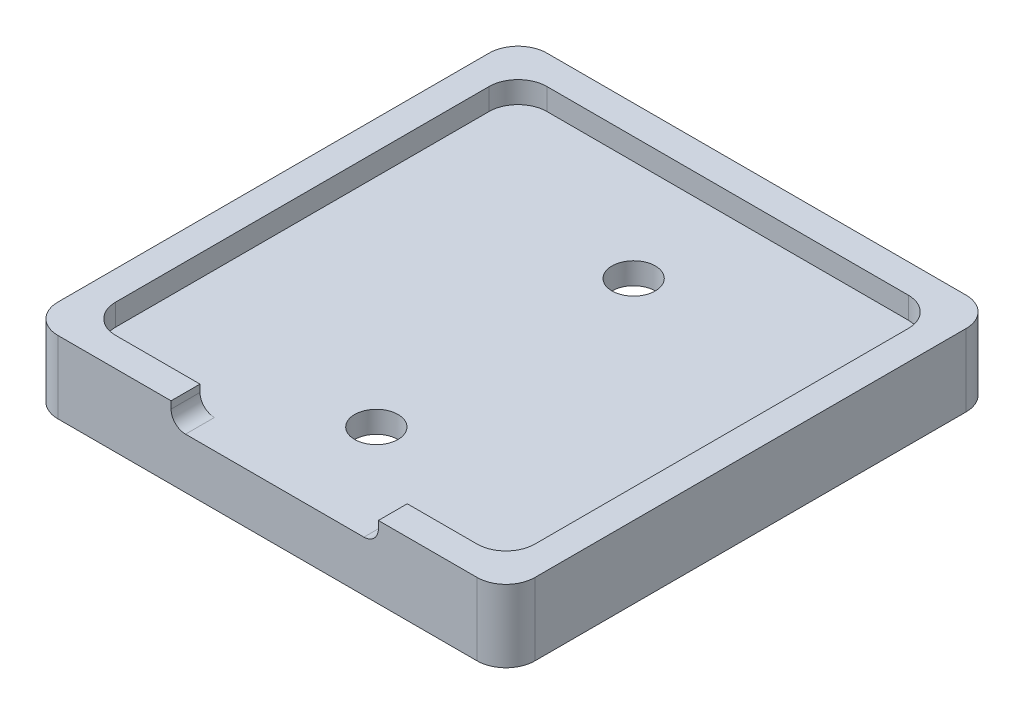
ISO-10303-21;
HEADER;
FILE_DESCRIPTION(('STEP AP214'),'2;1');
FILE_NAME('part.step','',(''),(''),'','','');
FILE_SCHEMA(('AUTOMOTIVE_DESIGN { 1 0 10303 214 1 1 1 1 }'));
ENDSEC;
DATA;
#1=APPLICATION_CONTEXT('core data for automotive mechanical design processes');
#2=APPLICATION_PROTOCOL_DEFINITION('international standard','automotive_design',2000,#1);
#3=PRODUCT_CONTEXT('',#1,'mechanical');
#4=PRODUCT('Part','Part','',(#3));
#5=PRODUCT_RELATED_PRODUCT_CATEGORY('part','',(#4));
#6=PRODUCT_DEFINITION_FORMATION('','',#4);
#7=PRODUCT_DEFINITION_CONTEXT('part definition',#1,'design');
#8=PRODUCT_DEFINITION('design','',#6,#7);
#9=PRODUCT_DEFINITION_SHAPE('','',#8);
#10=(LENGTH_UNIT() NAMED_UNIT(*) SI_UNIT(.MILLI.,.METRE.));
#11=(NAMED_UNIT(*) PLANE_ANGLE_UNIT() SI_UNIT($,.RADIAN.));
#12=(NAMED_UNIT(*) SI_UNIT($,.STERADIAN.) SOLID_ANGLE_UNIT());
#13=UNCERTAINTY_MEASURE_WITH_UNIT(LENGTH_MEASURE(1.E-05),#10,'distance_accuracy_value','');
#14=(GEOMETRIC_REPRESENTATION_CONTEXT(3) GLOBAL_UNCERTAINTY_ASSIGNED_CONTEXT((#13)) GLOBAL_UNIT_ASSIGNED_CONTEXT((#10,
#11,#12)) REPRESENTATION_CONTEXT('',''));
#15=CARTESIAN_POINT('',(0.,0.,0.));
#16=DIRECTION('',(0.,0.,1.));
#17=DIRECTION('',(1.,0.,0.));
#18=AXIS2_PLACEMENT_3D('',#15,#16,#17);
#19=CARTESIAN_POINT('',(-14.5,-1.5,14.915));
#20=DIRECTION('',(0.,0.,1.));
#21=DIRECTION('',(1.,0.,0.));
#22=AXIS2_PLACEMENT_3D('',#19,#20,#21);
#23=PLANE('',#22);
#24=DIRECTION('',(1.,0.,0.));
#25=VECTOR('',#24,1.);
#26=CARTESIAN_POINT('',(-14.5,-1.5,14.915));
#27=LINE('',#26,#25);
#28=CARTESIAN_POINT('',(6.67,-1.5,14.915));
#29=VERTEX_POINT('',#28);
#30=CARTESIAN_POINT('',(12.5,-1.5,14.915));
#31=VERTEX_POINT('',#30);
#32=EDGE_CURVE('E62',#29,#31,#27,.T.);
#33=ORIENTED_EDGE('',*,*,#32,.F.);
#34=CARTESIAN_POINT('',(6.67000000000001,-0.5,14.915));
#35=DIRECTION('',(0.,0.,1.));
#36=DIRECTION('',(1.,0.,0.));
#37=AXIS2_PLACEMENT_3D('',#34,#35,#36);
#38=CIRCLE('',#37,1.);
#39=CARTESIAN_POINT('',(7.67000000000001,-0.5,14.915));
#40=VERTEX_POINT('',#39);
#41=EDGE_CURVE('E11',#29,#40,#38,.T.);
#42=ORIENTED_EDGE('',*,*,#41,.T.);
#43=DIRECTION('',(0.,1.,0.));
#44=VECTOR('',#43,1.);
#45=CARTESIAN_POINT('',(7.67000000000001,-1.5,14.915));
#46=LINE('',#45,#44);
#47=CARTESIAN_POINT('',(7.67000000000001,0.,14.915));
#48=VERTEX_POINT('',#47);
#49=EDGE_CURVE('E512',#40,#48,#46,.T.);
#50=ORIENTED_EDGE('',*,*,#49,.T.);
#51=DIRECTION('',(1.,0.,0.));
#52=VECTOR('',#51,1.);
#53=CARTESIAN_POINT('',(-14.5,0.,14.915));
#54=LINE('',#53,#52);
#55=CARTESIAN_POINT('',(12.5,0.,14.915));
#56=VERTEX_POINT('',#55);
#57=EDGE_CURVE('E317',#48,#56,#54,.T.);
#58=ORIENTED_EDGE('',*,*,#57,.T.);
#59=DIRECTION('',(0.,1.,0.));
#60=VECTOR('',#59,1.);
#61=CARTESIAN_POINT('',(12.5,-1.5,14.915));
#62=LINE('',#61,#60);
#63=EDGE_CURVE('E354',#56,#31,#62,.F.);
#64=ORIENTED_EDGE('',*,*,#63,.T.);
#65=EDGE_LOOP('',(#33,#42,#50,#58,#64));
#66=FACE_BOUND('',#65,.T.);
#67=ADVANCED_FACE('F47',(#66),#23,.F.);
#68=CARTESIAN_POINT('',(5.50000000000001,-3.,9.885));
#69=DIRECTION('',(1.,0.,0.));
#70=DIRECTION('',(0.,0.,-1.));
#71=AXIS2_PLACEMENT_3D('',#68,#69,#70);
#72=PLANE('',#71);
#73=DIRECTION('',(0.,0.,1.));
#74=VECTOR('',#73,1.);
#75=CARTESIAN_POINT('',(5.50000000000001,-3.,9.885));
#76=LINE('',#75,#74);
#77=CARTESIAN_POINT('',(5.50000000000001,-3.,9.80203375084368));
#78=VERTEX_POINT('',#77);
#79=CARTESIAN_POINT('',(5.50000000000001,-3.,9.885));
#80=VERTEX_POINT('',#79);
#81=EDGE_CURVE('E588',#78,#80,#76,.T.);
#82=ORIENTED_EDGE('',*,*,#81,.F.);
#83=DIRECTION('',(0.,-1.,0.));
#84=VECTOR('',#83,1.);
#85=CARTESIAN_POINT('',(5.50000000000001,-3.,9.80203375084368));
#86=LINE('',#85,#84);
#87=CARTESIAN_POINT('',(5.50000000000001,-5.,9.80203375084368));
#88=VERTEX_POINT('',#87);
#89=EDGE_CURVE('E569',#78,#88,#86,.T.);
#90=ORIENTED_EDGE('',*,*,#89,.T.);
#91=DIRECTION('',(0.,0.,1.));
#92=VECTOR('',#91,1.);
#93=CARTESIAN_POINT('',(5.50000000000001,-5.,9.885));
#94=LINE('',#93,#92);
#95=CARTESIAN_POINT('',(5.50000000000001,-5.,9.885));
#96=VERTEX_POINT('',#95);
#97=EDGE_CURVE('E605',#88,#96,#94,.T.);
#98=ORIENTED_EDGE('',*,*,#97,.T.);
#99=DIRECTION('',(0.,-1.,0.));
#100=VECTOR('',#99,1.);
#101=CARTESIAN_POINT('',(5.50000000000001,-3.,9.885));
#102=LINE('',#101,#100);
#103=EDGE_CURVE('E322',#80,#96,#102,.T.);
#104=ORIENTED_EDGE('',*,*,#103,.F.);
#105=EDGE_LOOP('',(#82,#90,#98,#104));
#106=FACE_BOUND('',#105,.T.);
#107=ADVANCED_FACE('F708',(#106),#72,.F.);
#108=CARTESIAN_POINT('',(-4.49999999999999,-3.,9.885));
#109=DIRECTION('',(-1.,0.,0.));
#110=DIRECTION('',(0.,0.,1.));
#111=AXIS2_PLACEMENT_3D('',#108,#109,#110);
#112=PLANE('',#111);
#113=DIRECTION('',(0.,0.,-1.));
#114=VECTOR('',#113,1.);
#115=CARTESIAN_POINT('',(-4.49999999999999,-5.,9.885));
#116=LINE('',#115,#114);
#117=CARTESIAN_POINT('',(-4.49999999999999,-5.,9.885));
#118=VERTEX_POINT('',#117);
#119=CARTESIAN_POINT('',(-4.49999999999999,-5.,9.80203375084368));
#120=VERTEX_POINT('',#119);
#121=EDGE_CURVE('E597',#118,#120,#116,.T.);
#122=ORIENTED_EDGE('',*,*,#121,.T.);
#123=DIRECTION('',(0.,1.,0.));
#124=VECTOR('',#123,1.);
#125=CARTESIAN_POINT('',(-4.49999999999999,-3.,9.80203375084368));
#126=LINE('',#125,#124);
#127=CARTESIAN_POINT('',(-4.49999999999999,-3.,9.80203375084368));
#128=VERTEX_POINT('',#127);
#129=EDGE_CURVE('E432',#120,#128,#126,.T.);
#130=ORIENTED_EDGE('',*,*,#129,.T.);
#131=DIRECTION('',(0.,0.,-1.));
#132=VECTOR('',#131,1.);
#133=CARTESIAN_POINT('',(-4.49999999999999,-3.,9.885));
#134=LINE('',#133,#132);
#135=CARTESIAN_POINT('',(-4.49999999999999,-3.,9.885));
#136=VERTEX_POINT('',#135);
#137=EDGE_CURVE('E580',#136,#128,#134,.T.);
#138=ORIENTED_EDGE('',*,*,#137,.F.);
#139=DIRECTION('',(0.,-1.,0.));
#140=VECTOR('',#139,1.);
#141=CARTESIAN_POINT('',(-4.49999999999999,-3.,9.885));
#142=LINE('',#141,#140);
#143=EDGE_CURVE('E593',#136,#118,#142,.T.);
#144=ORIENTED_EDGE('',*,*,#143,.T.);
#145=EDGE_LOOP('',(#122,#130,#138,#144));
#146=FACE_BOUND('',#145,.T.);
#147=ADVANCED_FACE('F714',(#146),#112,.F.);
#148=CARTESIAN_POINT('',(0.500000000000011,-31.,9.885));
#149=DIRECTION('',(0.,1.,0.));
#150=DIRECTION('',(0.,0.,1.));
#151=AXIS2_PLACEMENT_3D('',#148,#149,#150);
#152=CYLINDRICAL_SURFACE('',#151,1.5);
#153=CARTESIAN_POINT('',(0.500000000000011,-1.5,9.885));
#154=DIRECTION('',(0.,1.,0.));
#155=DIRECTION('',(0.,0.,1.));
#156=AXIS2_PLACEMENT_3D('',#153,#154,#155);
#157=CIRCLE('',#156,1.5);
#158=CARTESIAN_POINT('',(0.500000000000011,-1.5,11.385));
#159=VERTEX_POINT('',#158);
#160=EDGE_CURVE('E308',#159,#159,#157,.T.);
#161=ORIENTED_EDGE('',*,*,#160,.T.);
#162=EDGE_LOOP('',(#161));
#163=FACE_BOUND('',#162,.T.);
#164=CARTESIAN_POINT('',(0.500000000000011,-3.,9.885));
#165=DIRECTION('',(0.,-1.,0.));
#166=DIRECTION('',(0.,0.,-1.));
#167=AXIS2_PLACEMENT_3D('',#164,#165,#166);
#168=CIRCLE('',#167,1.5);
#169=CARTESIAN_POINT('',(0.500000000000011,-3.,8.385));
#170=VERTEX_POINT('',#169);
#171=EDGE_CURVE('E313',#170,#170,#168,.F.);
#172=ORIENTED_EDGE('',*,*,#171,.F.);
#173=EDGE_LOOP('',(#172));
#174=FACE_BOUND('',#173,.T.);
#175=ADVANCED_FACE('F849',(#163,#174),#152,.F.);
#176=CARTESIAN_POINT('',(0.500000000000008,-31.,-7.915));
#177=DIRECTION('',(0.,1.,0.));
#178=DIRECTION('',(0.,0.,1.));
#179=AXIS2_PLACEMENT_3D('',#176,#177,#178);
#180=CYLINDRICAL_SURFACE('',#179,1.5);
#181=CARTESIAN_POINT('',(0.500000000000008,-1.5,-7.915));
#182=DIRECTION('',(0.,1.,0.));
#183=DIRECTION('',(0.,0.,1.));
#184=AXIS2_PLACEMENT_3D('',#181,#182,#183);
#185=CIRCLE('',#184,1.5);
#186=CARTESIAN_POINT('',(0.500000000000008,-1.5,-6.415));
#187=VERTEX_POINT('',#186);
#188=EDGE_CURVE('E312',#187,#187,#185,.T.);
#189=ORIENTED_EDGE('',*,*,#188,.T.);
#190=EDGE_LOOP('',(#189));
#191=FACE_BOUND('',#190,.T.);
#192=CARTESIAN_POINT('',(0.500000000000008,-3.,-7.915));
#193=DIRECTION('',(0.,-1.,0.));
#194=DIRECTION('',(0.,0.,-1.));
#195=AXIS2_PLACEMENT_3D('',#192,#193,#194);
#196=CIRCLE('',#195,1.5);
#197=CARTESIAN_POINT('',(0.500000000000008,-3.,-9.415));
#198=VERTEX_POINT('',#197);
#199=EDGE_CURVE('E318',#198,#198,#196,.F.);
#200=ORIENTED_EDGE('',*,*,#199,.F.);
#201=EDGE_LOOP('',(#200));
#202=FACE_BOUND('',#201,.T.);
#203=ADVANCED_FACE('F743',(#191,#202),#180,.F.);
#204=CARTESIAN_POINT('',(16.5,-5.,-16.915));
#205=DIRECTION('',(1.,0.,0.));
#206=DIRECTION('',(0.,0.,-1.));
#207=AXIS2_PLACEMENT_3D('',#204,#205,#206);
#208=PLANE('',#207);
#209=DIRECTION('',(0.,0.,-1.));
#210=VECTOR('',#209,1.);
#211=CARTESIAN_POINT('',(16.5,-5.,-16.915));
#212=LINE('',#211,#210);
#213=CARTESIAN_POINT('',(16.5,-5.,14.915));
#214=VERTEX_POINT('',#213);
#215=CARTESIAN_POINT('',(16.5,-5.,-14.915));
#216=VERTEX_POINT('',#215);
#217=EDGE_CURVE('E296',#214,#216,#212,.T.);
#218=ORIENTED_EDGE('',*,*,#217,.T.);
#219=DIRECTION('',(0.,1.,0.));
#220=VECTOR('',#219,1.);
#221=CARTESIAN_POINT('',(16.5,-5.,-14.915));
#222=LINE('',#221,#220);
#223=CARTESIAN_POINT('',(16.5,0.,-14.915));
#224=VERTEX_POINT('',#223);
#225=EDGE_CURVE('E411',#216,#224,#222,.T.);
#226=ORIENTED_EDGE('',*,*,#225,.T.);
#227=DIRECTION('',(0.,0.,-1.));
#228=VECTOR('',#227,1.);
#229=CARTESIAN_POINT('',(16.5,0.,-16.915));
#230=LINE('',#229,#228);
#231=CARTESIAN_POINT('',(16.5,0.,14.915));
#232=VERTEX_POINT('',#231);
#233=EDGE_CURVE('E471',#232,#224,#230,.T.);
#234=ORIENTED_EDGE('',*,*,#233,.F.);
#235=DIRECTION('',(0.,1.,0.));
#236=VECTOR('',#235,1.);
#237=CARTESIAN_POINT('',(16.5,-5.,14.915));
#238=LINE('',#237,#236);
#239=EDGE_CURVE('E408',#232,#214,#238,.F.);
#240=ORIENTED_EDGE('',*,*,#239,.T.);
#241=EDGE_LOOP('',(#218,#226,#234,#240));
#242=FACE_BOUND('',#241,.T.);
#243=ADVANCED_FACE('F736',(#242),#208,.T.);
#244=CARTESIAN_POINT('',(-16.5,-5.,16.915));
#245=DIRECTION('',(0.,0.,1.));
#246=DIRECTION('',(1.,0.,0.));
#247=AXIS2_PLACEMENT_3D('',#244,#245,#246);
#248=PLANE('',#247);
#249=DIRECTION('',(0.,1.,0.));
#250=VECTOR('',#249,1.);
#251=CARTESIAN_POINT('',(7.67000000000001,-1.5,16.915));
#252=LINE('',#251,#250);
#253=CARTESIAN_POINT('',(7.67000000000001,-0.5,16.915));
#254=VERTEX_POINT('',#253);
#255=CARTESIAN_POINT('',(7.67000000000001,0.,16.915));
#256=VERTEX_POINT('',#255);
#257=EDGE_CURVE('E281',#254,#256,#252,.T.);
#258=ORIENTED_EDGE('',*,*,#257,.F.);
#259=CARTESIAN_POINT('',(6.67000000000001,-0.5,16.915));
#260=DIRECTION('',(0.,0.,1.));
#261=DIRECTION('',(1.,0.,0.));
#262=AXIS2_PLACEMENT_3D('',#259,#260,#261);
#263=CIRCLE('',#262,1.);
#264=CARTESIAN_POINT('',(6.67000000000001,-1.5,16.915));
#265=VERTEX_POINT('',#264);
#266=EDGE_CURVE('E56',#254,#265,#263,.F.);
#267=ORIENTED_EDGE('',*,*,#266,.T.);
#268=DIRECTION('',(1.,0.,0.));
#269=VECTOR('',#268,1.);
#270=CARTESIAN_POINT('',(-6.66999999999999,-1.5,16.915));
#271=LINE('',#270,#269);
#272=CARTESIAN_POINT('',(-5.66999999999999,-1.5,16.915));
#273=VERTEX_POINT('',#272);
#274=EDGE_CURVE('E289',#273,#265,#271,.T.);
#275=ORIENTED_EDGE('',*,*,#274,.F.);
#276=CARTESIAN_POINT('',(-5.66999999999999,-0.5,16.915));
#277=DIRECTION('',(0.,0.,1.));
#278=DIRECTION('',(1.,0.,0.));
#279=AXIS2_PLACEMENT_3D('',#276,#277,#278);
#280=CIRCLE('',#279,1.);
#281=CARTESIAN_POINT('',(-6.66999999999999,-0.5,16.915));
#282=VERTEX_POINT('',#281);
#283=EDGE_CURVE('E287',#273,#282,#280,.F.);
#284=ORIENTED_EDGE('',*,*,#283,.T.);
#285=DIRECTION('',(0.,-1.,0.));
#286=VECTOR('',#285,1.);
#287=CARTESIAN_POINT('',(-6.66999999999999,0.,16.915));
#288=LINE('',#287,#286);
#289=CARTESIAN_POINT('',(-6.66999999999999,0.,16.915));
#290=VERTEX_POINT('',#289);
#291=EDGE_CURVE('E271',#290,#282,#288,.T.);
#292=ORIENTED_EDGE('',*,*,#291,.F.);
#293=DIRECTION('',(1.,0.,0.));
#294=VECTOR('',#293,1.);
#295=CARTESIAN_POINT('',(-16.5,0.,16.915));
#296=LINE('',#295,#294);
#297=CARTESIAN_POINT('',(-14.5,0.,16.915));
#298=VERTEX_POINT('',#297);
#299=EDGE_CURVE('E285',#298,#290,#296,.T.);
#300=ORIENTED_EDGE('',*,*,#299,.F.);
#301=DIRECTION('',(0.,1.,0.));
#302=VECTOR('',#301,1.);
#303=CARTESIAN_POINT('',(-14.5,-5.,16.915));
#304=LINE('',#303,#302);
#305=CARTESIAN_POINT('',(-14.5,-5.,16.915));
#306=VERTEX_POINT('',#305);
#307=EDGE_CURVE('E386',#298,#306,#304,.F.);
#308=ORIENTED_EDGE('',*,*,#307,.T.);
#309=DIRECTION('',(1.,0.,0.));
#310=VECTOR('',#309,1.);
#311=CARTESIAN_POINT('',(-16.5,-5.,16.915));
#312=LINE('',#311,#310);
#313=CARTESIAN_POINT('',(14.5,-5.,16.915));
#314=VERTEX_POINT('',#313);
#315=EDGE_CURVE('E327',#306,#314,#312,.T.);
#316=ORIENTED_EDGE('',*,*,#315,.T.);
#317=DIRECTION('',(0.,1.,0.));
#318=VECTOR('',#317,1.);
#319=CARTESIAN_POINT('',(14.5,-5.,16.915));
#320=LINE('',#319,#318);
#321=CARTESIAN_POINT('',(14.5,0.,16.915));
#322=VERTEX_POINT('',#321);
#323=EDGE_CURVE('E382',#314,#322,#320,.T.);
#324=ORIENTED_EDGE('',*,*,#323,.T.);
#325=EDGE_CURVE('E297',#256,#322,#296,.T.);
#326=ORIENTED_EDGE('',*,*,#325,.F.);
#327=EDGE_LOOP('',(#258,#267,#275,#284,#292,#300,#308,#316,#324,#326));
#328=FACE_BOUND('',#327,.T.);
#329=ADVANCED_FACE('F284',(#328),#248,.T.);
#330=CARTESIAN_POINT('',(-16.5,-5.,-16.915));
#331=DIRECTION('',(-1.,0.,0.));
#332=DIRECTION('',(0.,0.,1.));
#333=AXIS2_PLACEMENT_3D('',#330,#331,#332);
#334=PLANE('',#333);
#335=DIRECTION('',(0.,0.,1.));
#336=VECTOR('',#335,1.);
#337=CARTESIAN_POINT('',(-16.5,-5.,-16.915));
#338=LINE('',#337,#336);
#339=CARTESIAN_POINT('',(-16.5,-5.,-14.915));
#340=VERTEX_POINT('',#339);
#341=CARTESIAN_POINT('',(-16.5,-5.,14.915));
#342=VERTEX_POINT('',#341);
#343=EDGE_CURVE('E459',#340,#342,#338,.T.);
#344=ORIENTED_EDGE('',*,*,#343,.T.);
#345=DIRECTION('',(0.,1.,0.));
#346=VECTOR('',#345,1.);
#347=CARTESIAN_POINT('',(-16.5,-5.,14.915));
#348=LINE('',#347,#346);
#349=CARTESIAN_POINT('',(-16.5,0.,14.915));
#350=VERTEX_POINT('',#349);
#351=EDGE_CURVE('E367',#342,#350,#348,.T.);
#352=ORIENTED_EDGE('',*,*,#351,.T.);
#353=DIRECTION('',(0.,0.,1.));
#354=VECTOR('',#353,1.);
#355=CARTESIAN_POINT('',(-16.5,0.,-16.915));
#356=LINE('',#355,#354);
#357=CARTESIAN_POINT('',(-16.5,0.,-14.915));
#358=VERTEX_POINT('',#357);
#359=EDGE_CURVE('E304',#358,#350,#356,.T.);
#360=ORIENTED_EDGE('',*,*,#359,.F.);
#361=DIRECTION('',(0.,1.,0.));
#362=VECTOR('',#361,1.);
#363=CARTESIAN_POINT('',(-16.5,-5.,-14.915));
#364=LINE('',#363,#362);
#365=EDGE_CURVE('E364',#358,#340,#364,.F.);
#366=ORIENTED_EDGE('',*,*,#365,.T.);
#367=EDGE_LOOP('',(#344,#352,#360,#366));
#368=FACE_BOUND('',#367,.T.);
#369=ADVANCED_FACE('F483',(#368),#334,.T.);
#370=CARTESIAN_POINT('',(-16.5,-5.,-16.915));
#371=DIRECTION('',(0.,0.,-1.));
#372=DIRECTION('',(-1.,0.,0.));
#373=AXIS2_PLACEMENT_3D('',#370,#371,#372);
#374=PLANE('',#373);
#375=DIRECTION('',(-1.,0.,0.));
#376=VECTOR('',#375,1.);
#377=CARTESIAN_POINT('',(-16.5,-5.,-16.915));
#378=LINE('',#377,#376);
#379=CARTESIAN_POINT('',(14.5,-5.,-16.915));
#380=VERTEX_POINT('',#379);
#381=CARTESIAN_POINT('',(-14.5,-5.,-16.915));
#382=VERTEX_POINT('',#381);
#383=EDGE_CURVE('E302',#380,#382,#378,.T.);
#384=ORIENTED_EDGE('',*,*,#383,.T.);
#385=DIRECTION('',(0.,1.,0.));
#386=VECTOR('',#385,1.);
#387=CARTESIAN_POINT('',(-14.5,-5.,-16.915));
#388=LINE('',#387,#386);
#389=CARTESIAN_POINT('',(-14.5,0.,-16.915));
#390=VERTEX_POINT('',#389);
#391=EDGE_CURVE('E404',#382,#390,#388,.T.);
#392=ORIENTED_EDGE('',*,*,#391,.T.);
#393=DIRECTION('',(-1.,0.,0.));
#394=VECTOR('',#393,1.);
#395=CARTESIAN_POINT('',(-16.5,0.,-16.915));
#396=LINE('',#395,#394);
#397=CARTESIAN_POINT('',(14.5,0.,-16.915));
#398=VERTEX_POINT('',#397);
#399=EDGE_CURVE('E474',#398,#390,#396,.T.);
#400=ORIENTED_EDGE('',*,*,#399,.F.);
#401=DIRECTION('',(0.,1.,0.));
#402=VECTOR('',#401,1.);
#403=CARTESIAN_POINT('',(14.5,-5.,-16.915));
#404=LINE('',#403,#402);
#405=EDGE_CURVE('E401',#398,#380,#404,.F.);
#406=ORIENTED_EDGE('',*,*,#405,.T.);
#407=EDGE_LOOP('',(#384,#392,#400,#406));
#408=FACE_BOUND('',#407,.T.);
#409=ADVANCED_FACE('F732',(#408),#374,.T.);
#410=CARTESIAN_POINT('',(0.,-5.,0.));
#411=DIRECTION('',(0.,1.,0.));
#412=DIRECTION('',(0.,0.,1.));
#413=AXIS2_PLACEMENT_3D('',#410,#411,#412);
#414=PLANE('',#413);
#415=ORIENTED_EDGE('',*,*,#97,.F.);
#416=DIRECTION('',(-1.,0.,0.));
#417=VECTOR('',#416,1.);
#418=CARTESIAN_POINT('',(-5.34897163312394,-5.,9.80203375084368));
#419=LINE('',#418,#417);
#420=CARTESIAN_POINT('',(6.29587124224953,-5.,9.80203375084368));
#421=VERTEX_POINT('',#420);
#422=EDGE_CURVE('E525',#421,#88,#419,.T.);
#423=ORIENTED_EDGE('',*,*,#422,.F.);
#424=DIRECTION('',(0.,0.,1.));
#425=VECTOR('',#424,1.);
#426=CARTESIAN_POINT('',(6.29587124224953,-5.,9.80203375084368));
#427=LINE('',#426,#425);
#428=CARTESIAN_POINT('',(6.29587124224953,-5.,7.20513073792854));
#429=VERTEX_POINT('',#428);
#430=EDGE_CURVE('E545',#429,#421,#427,.T.);
#431=ORIENTED_EDGE('',*,*,#430,.F.);
#432=DIRECTION('',(1.,0.,0.));
#433=VECTOR('',#432,1.);
#434=CARTESIAN_POINT('',(-5.34897163312394,-5.,7.20513073792854));
#435=LINE('',#434,#433);
#436=CARTESIAN_POINT('',(5.50000000000001,-5.,7.20513073792854));
#437=VERTEX_POINT('',#436);
#438=EDGE_CURVE('E541',#437,#429,#435,.T.);
#439=ORIENTED_EDGE('',*,*,#438,.F.);
#440=CARTESIAN_POINT('',(5.50000000000001,-5.,-7.915));
#441=VERTEX_POINT('',#440);
#442=EDGE_CURVE('E579',#441,#437,#94,.T.);
#443=ORIENTED_EDGE('',*,*,#442,.F.);
#444=CARTESIAN_POINT('',(0.500000000000008,-5.,-7.915));
#445=DIRECTION('',(0.,-1.,0.));
#446=DIRECTION('',(0.,0.,-1.));
#447=AXIS2_PLACEMENT_3D('',#444,#445,#446);
#448=CIRCLE('',#447,5.);
#449=CARTESIAN_POINT('',(-4.49999999999999,-5.,-7.915));
#450=VERTEX_POINT('',#449);
#451=EDGE_CURVE('E601',#450,#441,#448,.T.);
#452=ORIENTED_EDGE('',*,*,#451,.F.);
#453=CARTESIAN_POINT('',(-4.49999999999999,-5.,7.20513073792854));
#454=VERTEX_POINT('',#453);
#455=EDGE_CURVE('E596',#454,#450,#116,.T.);
#456=ORIENTED_EDGE('',*,*,#455,.F.);
#457=CARTESIAN_POINT('',(-5.34897163312394,-5.,7.20513073792854));
#458=VERTEX_POINT('',#457);
#459=EDGE_CURVE('E542',#458,#454,#435,.T.);
#460=ORIENTED_EDGE('',*,*,#459,.F.);
#461=DIRECTION('',(0.,0.,-1.));
#462=VECTOR('',#461,1.);
#463=CARTESIAN_POINT('',(-5.34897163312394,-5.,9.80203375084368));
#464=LINE('',#463,#462);
#465=CARTESIAN_POINT('',(-5.34897163312394,-5.,9.80203375084368));
#466=VERTEX_POINT('',#465);
#467=EDGE_CURVE('E519',#466,#458,#464,.T.);
#468=ORIENTED_EDGE('',*,*,#467,.F.);
#469=EDGE_CURVE('E549',#120,#466,#419,.T.);
#470=ORIENTED_EDGE('',*,*,#469,.F.);
#471=ORIENTED_EDGE('',*,*,#121,.F.);
#472=CARTESIAN_POINT('',(0.500000000000011,-5.,9.885));
#473=DIRECTION('',(0.,-1.,0.));
#474=DIRECTION('',(0.,0.,-1.));
#475=AXIS2_PLACEMENT_3D('',#472,#473,#474);
#476=CIRCLE('',#475,5.);
#477=EDGE_CURVE('E573',#96,#118,#476,.T.);
#478=ORIENTED_EDGE('',*,*,#477,.F.);
#479=EDGE_LOOP('',(#415,#423,#431,#439,#443,#452,#456,#460,#468,#470,#471,#478));
#480=FACE_BOUND('',#479,.T.);
#481=ORIENTED_EDGE('',*,*,#315,.F.);
#482=CARTESIAN_POINT('',(-14.5,-5.,14.915));
#483=DIRECTION('',(0.,1.,0.));
#484=DIRECTION('',(0.,0.,1.));
#485=AXIS2_PLACEMENT_3D('',#482,#483,#484);
#486=CIRCLE('',#485,2.);
#487=EDGE_CURVE('E398',#306,#342,#486,.F.);
#488=ORIENTED_EDGE('',*,*,#487,.T.);
#489=ORIENTED_EDGE('',*,*,#343,.F.);
#490=CARTESIAN_POINT('',(-14.5,-5.,-14.915));
#491=DIRECTION('',(0.,1.,0.));
#492=DIRECTION('',(0.,0.,1.));
#493=AXIS2_PLACEMENT_3D('',#490,#491,#492);
#494=CIRCLE('',#493,2.);
#495=EDGE_CURVE('E395',#340,#382,#494,.F.);
#496=ORIENTED_EDGE('',*,*,#495,.T.);
#497=ORIENTED_EDGE('',*,*,#383,.F.);
#498=CARTESIAN_POINT('',(14.5,-5.,-14.915));
#499=DIRECTION('',(0.,1.,0.));
#500=DIRECTION('',(0.,0.,1.));
#501=AXIS2_PLACEMENT_3D('',#498,#499,#500);
#502=CIRCLE('',#501,2.);
#503=EDGE_CURVE('E392',#380,#216,#502,.F.);
#504=ORIENTED_EDGE('',*,*,#503,.T.);
#505=ORIENTED_EDGE('',*,*,#217,.F.);
#506=CARTESIAN_POINT('',(14.5,-5.,14.915));
#507=DIRECTION('',(0.,1.,0.));
#508=DIRECTION('',(0.,0.,1.));
#509=AXIS2_PLACEMENT_3D('',#506,#507,#508);
#510=CIRCLE('',#509,2.);
#511=EDGE_CURVE('E389',#214,#314,#510,.F.);
#512=ORIENTED_EDGE('',*,*,#511,.T.);
#513=EDGE_LOOP('',(#481,#488,#489,#496,#497,#504,#505,#512));
#514=FACE_BOUND('',#513,.T.);
#515=ADVANCED_FACE('F491',(#480,#514),#414,.F.);
#516=CARTESIAN_POINT('',(0.,0.,0.));
#517=DIRECTION('',(0.,1.,0.));
#518=DIRECTION('',(0.,0.,1.));
#519=AXIS2_PLACEMENT_3D('',#516,#517,#518);
#520=PLANE('',#519);
#521=DIRECTION('',(0.,0.,1.));
#522=VECTOR('',#521,1.);
#523=CARTESIAN_POINT('',(7.67000000000001,0.,6.915));
#524=LINE('',#523,#522);
#525=EDGE_CURVE('E280',#48,#256,#524,.T.);
#526=ORIENTED_EDGE('',*,*,#525,.T.);
#527=ORIENTED_EDGE('',*,*,#325,.T.);
#528=CARTESIAN_POINT('',(14.5,0.,14.915));
#529=DIRECTION('',(0.,1.,0.));
#530=DIRECTION('',(0.,0.,1.));
#531=AXIS2_PLACEMENT_3D('',#528,#529,#530);
#532=CIRCLE('',#531,2.);
#533=EDGE_CURVE('E371',#322,#232,#532,.T.);
#534=ORIENTED_EDGE('',*,*,#533,.T.);
#535=ORIENTED_EDGE('',*,*,#233,.T.);
#536=CARTESIAN_POINT('',(14.5,0.,-14.915));
#537=DIRECTION('',(0.,1.,0.));
#538=DIRECTION('',(0.,0.,1.));
#539=AXIS2_PLACEMENT_3D('',#536,#537,#538);
#540=CIRCLE('',#539,2.);
#541=EDGE_CURVE('E374',#224,#398,#540,.T.);
#542=ORIENTED_EDGE('',*,*,#541,.T.);
#543=ORIENTED_EDGE('',*,*,#399,.T.);
#544=CARTESIAN_POINT('',(-14.5,0.,-14.915));
#545=DIRECTION('',(0.,1.,0.));
#546=DIRECTION('',(0.,0.,1.));
#547=AXIS2_PLACEMENT_3D('',#544,#545,#546);
#548=CIRCLE('',#547,2.);
#549=EDGE_CURVE('E377',#390,#358,#548,.T.);
#550=ORIENTED_EDGE('',*,*,#549,.T.);
#551=ORIENTED_EDGE('',*,*,#359,.T.);
#552=CARTESIAN_POINT('',(-14.5,0.,14.915));
#553=DIRECTION('',(0.,1.,0.));
#554=DIRECTION('',(0.,0.,1.));
#555=AXIS2_PLACEMENT_3D('',#552,#553,#554);
#556=CIRCLE('',#555,2.);
#557=EDGE_CURVE('E294',#350,#298,#556,.T.);
#558=ORIENTED_EDGE('',*,*,#557,.T.);
#559=ORIENTED_EDGE('',*,*,#299,.T.);
#560=DIRECTION('',(0.,0.,1.));
#561=VECTOR('',#560,1.);
#562=CARTESIAN_POINT('',(-6.66999999999999,0.,6.915));
#563=LINE('',#562,#561);
#564=CARTESIAN_POINT('',(-6.66999999999999,0.,14.915));
#565=VERTEX_POINT('',#564);
#566=EDGE_CURVE('E268',#565,#290,#563,.T.);
#567=ORIENTED_EDGE('',*,*,#566,.F.);
#568=CARTESIAN_POINT('',(-12.5,0.,14.915));
#569=VERTEX_POINT('',#568);
#570=EDGE_CURVE('E639',#569,#565,#54,.T.);
#571=ORIENTED_EDGE('',*,*,#570,.F.);
#572=CARTESIAN_POINT('',(-12.5,0.,12.915));
#573=DIRECTION('',(0.,1.,0.));
#574=DIRECTION('',(0.,0.,1.));
#575=AXIS2_PLACEMENT_3D('',#572,#573,#574);
#576=CIRCLE('',#575,2.);
#577=CARTESIAN_POINT('',(-14.5,0.,12.915));
#578=VERTEX_POINT('',#577);
#579=EDGE_CURVE('E422',#569,#578,#576,.F.);
#580=ORIENTED_EDGE('',*,*,#579,.T.);
#581=DIRECTION('',(0.,0.,1.));
#582=VECTOR('',#581,1.);
#583=CARTESIAN_POINT('',(-14.5,0.,-14.915));
#584=LINE('',#583,#582);
#585=CARTESIAN_POINT('',(-14.5,0.,-12.915));
#586=VERTEX_POINT('',#585);
#587=EDGE_CURVE('E649',#586,#578,#584,.T.);
#588=ORIENTED_EDGE('',*,*,#587,.F.);
#589=CARTESIAN_POINT('',(-12.5,0.,-12.915));
#590=DIRECTION('',(0.,1.,0.));
#591=DIRECTION('',(0.,0.,1.));
#592=AXIS2_PLACEMENT_3D('',#589,#590,#591);
#593=CIRCLE('',#592,2.);
#594=CARTESIAN_POINT('',(-12.5,0.,-14.915));
#595=VERTEX_POINT('',#594);
#596=EDGE_CURVE('E425',#586,#595,#593,.F.);
#597=ORIENTED_EDGE('',*,*,#596,.T.);
#598=DIRECTION('',(-1.,0.,0.));
#599=VECTOR('',#598,1.);
#600=CARTESIAN_POINT('',(14.5,0.,-14.915));
#601=LINE('',#600,#599);
#602=CARTESIAN_POINT('',(12.5,0.,-14.915));
#603=VERTEX_POINT('',#602);
#604=EDGE_CURVE('E646',#603,#595,#601,.T.);
#605=ORIENTED_EDGE('',*,*,#604,.F.);
#606=CARTESIAN_POINT('',(12.5,0.,-12.915));
#607=DIRECTION('',(0.,1.,0.));
#608=DIRECTION('',(0.,0.,1.));
#609=AXIS2_PLACEMENT_3D('',#606,#607,#608);
#610=CIRCLE('',#609,2.);
#611=CARTESIAN_POINT('',(14.5,0.,-12.915));
#612=VERTEX_POINT('',#611);
#613=EDGE_CURVE('E415',#603,#612,#610,.F.);
#614=ORIENTED_EDGE('',*,*,#613,.T.);
#615=DIRECTION('',(0.,0.,-1.));
#616=VECTOR('',#615,1.);
#617=CARTESIAN_POINT('',(14.5,0.,14.915));
#618=LINE('',#617,#616);
#619=CARTESIAN_POINT('',(14.5,0.,12.915));
#620=VERTEX_POINT('',#619);
#621=EDGE_CURVE('E642',#620,#612,#618,.T.);
#622=ORIENTED_EDGE('',*,*,#621,.F.);
#623=CARTESIAN_POINT('',(12.5,0.,12.915));
#624=DIRECTION('',(0.,1.,0.));
#625=DIRECTION('',(0.,0.,1.));
#626=AXIS2_PLACEMENT_3D('',#623,#624,#625);
#627=CIRCLE('',#626,2.);
#628=EDGE_CURVE('E418',#620,#56,#627,.F.);
#629=ORIENTED_EDGE('',*,*,#628,.T.);
#630=ORIENTED_EDGE('',*,*,#57,.F.);
#631=EDGE_LOOP('',(#526,#527,#534,#535,#542,#543,#550,#551,#558,#559,#567,#571,#580,#588,#597,
#605,#614,#622,#629,#630));
#632=FACE_BOUND('',#631,.T.);
#633=ADVANCED_FACE('F292',(#632),#520,.T.);
#634=ORIENTED_EDGE('',*,*,#570,.T.);
#635=DIRECTION('',(0.,-1.,0.));
#636=VECTOR('',#635,1.);
#637=CARTESIAN_POINT('',(-6.66999999999999,-1.5,14.915));
#638=LINE('',#637,#636);
#639=CARTESIAN_POINT('',(-6.66999999999999,-0.5,14.915));
#640=VERTEX_POINT('',#639);
#641=EDGE_CURVE('E274',#565,#640,#638,.T.);
#642=ORIENTED_EDGE('',*,*,#641,.T.);
#643=CARTESIAN_POINT('',(-5.66999999999999,-0.5,14.915));
#644=DIRECTION('',(0.,0.,1.));
#645=DIRECTION('',(1.,0.,0.));
#646=AXIS2_PLACEMENT_3D('',#643,#644,#645);
#647=CIRCLE('',#646,1.);
#648=CARTESIAN_POINT('',(-5.66999999999999,-1.5,14.915));
#649=VERTEX_POINT('',#648);
#650=EDGE_CURVE('E445',#640,#649,#647,.T.);
#651=ORIENTED_EDGE('',*,*,#650,.T.);
#652=CARTESIAN_POINT('',(-12.5,-1.5,14.915));
#653=VERTEX_POINT('',#652);
#654=EDGE_CURVE('E625',#653,#649,#27,.T.);
#655=ORIENTED_EDGE('',*,*,#654,.F.);
#656=DIRECTION('',(0.,1.,0.));
#657=VECTOR('',#656,1.);
#658=CARTESIAN_POINT('',(-12.5,0.,14.915));
#659=LINE('',#658,#657);
#660=EDGE_CURVE('E350',#653,#569,#659,.T.);
#661=ORIENTED_EDGE('',*,*,#660,.T.);
#662=EDGE_LOOP('',(#634,#642,#651,#655,#661));
#663=FACE_BOUND('',#662,.T.);
#664=ADVANCED_FACE('F692',(#663),#23,.F.);
#665=CARTESIAN_POINT('',(-14.5,-1.5,-14.915));
#666=DIRECTION('',(-1.,0.,0.));
#667=DIRECTION('',(0.,0.,1.));
#668=AXIS2_PLACEMENT_3D('',#665,#666,#667);
#669=PLANE('',#668);
#670=ORIENTED_EDGE('',*,*,#587,.T.);
#671=DIRECTION('',(0.,1.,0.));
#672=VECTOR('',#671,1.);
#673=CARTESIAN_POINT('',(-14.5,-1.5,12.915));
#674=LINE('',#673,#672);
#675=CARTESIAN_POINT('',(-14.5,-1.5,12.915));
#676=VERTEX_POINT('',#675);
#677=EDGE_CURVE('E361',#578,#676,#674,.F.);
#678=ORIENTED_EDGE('',*,*,#677,.T.);
#679=DIRECTION('',(0.,0.,1.));
#680=VECTOR('',#679,1.);
#681=CARTESIAN_POINT('',(-14.5,-1.5,-14.915));
#682=LINE('',#681,#680);
#683=CARTESIAN_POINT('',(-14.5,-1.5,-12.915));
#684=VERTEX_POINT('',#683);
#685=EDGE_CURVE('E475',#684,#676,#682,.T.);
#686=ORIENTED_EDGE('',*,*,#685,.F.);
#687=DIRECTION('',(0.,1.,0.));
#688=VECTOR('',#687,1.);
#689=CARTESIAN_POINT('',(-14.5,0.,-12.915));
#690=LINE('',#689,#688);
#691=EDGE_CURVE('E357',#684,#586,#690,.T.);
#692=ORIENTED_EDGE('',*,*,#691,.T.);
#693=EDGE_LOOP('',(#670,#678,#686,#692));
#694=FACE_BOUND('',#693,.T.);
#695=ADVANCED_FACE('F685',(#694),#669,.F.);
#696=CARTESIAN_POINT('',(14.5,-1.5,-14.915));
#697=DIRECTION('',(0.,0.,-1.));
#698=DIRECTION('',(-1.,0.,0.));
#699=AXIS2_PLACEMENT_3D('',#696,#697,#698);
#700=PLANE('',#699);
#701=DIRECTION('',(-1.,0.,0.));
#702=VECTOR('',#701,1.);
#703=CARTESIAN_POINT('',(14.5,-1.5,-14.915));
#704=LINE('',#703,#702);
#705=CARTESIAN_POINT('',(12.5,-1.5,-14.915));
#706=VERTEX_POINT('',#705);
#707=CARTESIAN_POINT('',(-12.5,-1.5,-14.915));
#708=VERTEX_POINT('',#707);
#709=EDGE_CURVE('E632',#706,#708,#704,.T.);
#710=ORIENTED_EDGE('',*,*,#709,.F.);
#711=DIRECTION('',(0.,1.,0.));
#712=VECTOR('',#711,1.);
#713=CARTESIAN_POINT('',(12.5,0.,-14.915));
#714=LINE('',#713,#712);
#715=EDGE_CURVE('E326',#706,#603,#714,.T.);
#716=ORIENTED_EDGE('',*,*,#715,.T.);
#717=ORIENTED_EDGE('',*,*,#604,.T.);
#718=DIRECTION('',(0.,1.,0.));
#719=VECTOR('',#718,1.);
#720=CARTESIAN_POINT('',(-12.5,-1.5,-14.915));
#721=LINE('',#720,#719);
#722=EDGE_CURVE('E323',#595,#708,#721,.F.);
#723=ORIENTED_EDGE('',*,*,#722,.T.);
#724=EDGE_LOOP('',(#710,#716,#717,#723));
#725=FACE_BOUND('',#724,.T.);
#726=ADVANCED_FACE('F678',(#725),#700,.F.);
#727=CARTESIAN_POINT('',(14.5,-1.5,14.915));
#728=DIRECTION('',(1.,0.,0.));
#729=DIRECTION('',(0.,0.,-1.));
#730=AXIS2_PLACEMENT_3D('',#727,#728,#729);
#731=PLANE('',#730);
#732=ORIENTED_EDGE('',*,*,#621,.T.);
#733=DIRECTION('',(0.,1.,0.));
#734=VECTOR('',#733,1.);
#735=CARTESIAN_POINT('',(14.5,-1.5,-12.915));
#736=LINE('',#735,#734);
#737=CARTESIAN_POINT('',(14.5,-1.5,-12.915));
#738=VERTEX_POINT('',#737);
#739=EDGE_CURVE('E335',#612,#738,#736,.F.);
#740=ORIENTED_EDGE('',*,*,#739,.T.);
#741=DIRECTION('',(0.,0.,-1.));
#742=VECTOR('',#741,1.);
#743=CARTESIAN_POINT('',(14.5,-1.5,14.915));
#744=LINE('',#743,#742);
#745=CARTESIAN_POINT('',(14.5,-1.5,12.915));
#746=VERTEX_POINT('',#745);
#747=EDGE_CURVE('E628',#746,#738,#744,.T.);
#748=ORIENTED_EDGE('',*,*,#747,.F.);
#749=DIRECTION('',(0.,1.,0.));
#750=VECTOR('',#749,1.);
#751=CARTESIAN_POINT('',(14.5,0.,12.915));
#752=LINE('',#751,#750);
#753=EDGE_CURVE('E331',#746,#620,#752,.T.);
#754=ORIENTED_EDGE('',*,*,#753,.T.);
#755=EDGE_LOOP('',(#732,#740,#748,#754));
#756=FACE_BOUND('',#755,.T.);
#757=ADVANCED_FACE('F669',(#756),#731,.F.);
#758=CARTESIAN_POINT('',(0.,-1.5,0.));
#759=DIRECTION('',(0.,1.,0.));
#760=DIRECTION('',(0.,0.,1.));
#761=AXIS2_PLACEMENT_3D('',#758,#759,#760);
#762=PLANE('',#761);
#763=ORIENTED_EDGE('',*,*,#274,.T.);
#764=DIRECTION('',(0.,0.,1.));
#765=VECTOR('',#764,1.);
#766=CARTESIAN_POINT('',(6.67000000000001,-1.5,0.));
#767=LINE('',#766,#765);
#768=EDGE_CURVE('E453',#265,#29,#767,.F.);
#769=ORIENTED_EDGE('',*,*,#768,.T.);
#770=ORIENTED_EDGE('',*,*,#32,.T.);
#771=CARTESIAN_POINT('',(12.5,-1.5,12.915));
#772=DIRECTION('',(0.,1.,0.));
#773=DIRECTION('',(0.,0.,1.));
#774=AXIS2_PLACEMENT_3D('',#771,#772,#773);
#775=CIRCLE('',#774,2.);
#776=EDGE_CURVE('E344',#31,#746,#775,.T.);
#777=ORIENTED_EDGE('',*,*,#776,.T.);
#778=ORIENTED_EDGE('',*,*,#747,.T.);
#779=CARTESIAN_POINT('',(12.5,-1.5,-12.915));
#780=DIRECTION('',(0.,1.,0.));
#781=DIRECTION('',(0.,0.,1.));
#782=AXIS2_PLACEMENT_3D('',#779,#780,#781);
#783=CIRCLE('',#782,2.);
#784=EDGE_CURVE('E347',#738,#706,#783,.T.);
#785=ORIENTED_EDGE('',*,*,#784,.T.);
#786=ORIENTED_EDGE('',*,*,#709,.T.);
#787=CARTESIAN_POINT('',(-12.5,-1.5,-12.915));
#788=DIRECTION('',(0.,1.,0.));
#789=DIRECTION('',(0.,0.,1.));
#790=AXIS2_PLACEMENT_3D('',#787,#788,#789);
#791=CIRCLE('',#790,2.);
#792=EDGE_CURVE('E338',#708,#684,#791,.T.);
#793=ORIENTED_EDGE('',*,*,#792,.T.);
#794=ORIENTED_EDGE('',*,*,#685,.T.);
#795=CARTESIAN_POINT('',(-12.5,-1.5,12.915));
#796=DIRECTION('',(0.,1.,0.));
#797=DIRECTION('',(0.,0.,1.));
#798=AXIS2_PLACEMENT_3D('',#795,#796,#797);
#799=CIRCLE('',#798,2.);
#800=EDGE_CURVE('E341',#676,#653,#799,.T.);
#801=ORIENTED_EDGE('',*,*,#800,.T.);
#802=ORIENTED_EDGE('',*,*,#654,.T.);
#803=DIRECTION('',(0.,0.,1.));
#804=VECTOR('',#803,1.);
#805=CARTESIAN_POINT('',(-5.66999999999999,-1.5,0.));
#806=LINE('',#805,#804);
#807=EDGE_CURVE('E436',#649,#273,#806,.T.);
#808=ORIENTED_EDGE('',*,*,#807,.T.);
#809=EDGE_LOOP('',(#763,#769,#770,#777,#778,#785,#786,#793,#794,#801,#802,#808));
#810=FACE_BOUND('',#809,.T.);
#811=ORIENTED_EDGE('',*,*,#188,.F.);
#812=EDGE_LOOP('',(#811));
#813=FACE_BOUND('',#812,.T.);
#814=ORIENTED_EDGE('',*,*,#160,.F.);
#815=EDGE_LOOP('',(#814));
#816=FACE_BOUND('',#815,.T.);
#817=ADVANCED_FACE('F657',(#810,#813,#816),#762,.T.);
#818=CARTESIAN_POINT('',(0.500000000000011,-3.,9.885));
#819=DIRECTION('',(0.,-1.,0.));
#820=DIRECTION('',(0.,0.,-1.));
#821=AXIS2_PLACEMENT_3D('',#818,#819,#820);
#822=PLANE('',#821);
#823=ORIENTED_EDGE('',*,*,#171,.T.);
#824=EDGE_LOOP('',(#823));
#825=FACE_BOUND('',#824,.T.);
#826=CARTESIAN_POINT('',(5.50000000000001,-3.,-7.915));
#827=VERTEX_POINT('',#826);
#828=CARTESIAN_POINT('',(5.50000000000001,-3.,7.20513073792854));
#829=VERTEX_POINT('',#828);
#830=EDGE_CURVE('E589',#827,#829,#76,.T.);
#831=ORIENTED_EDGE('',*,*,#830,.T.);
#832=DIRECTION('',(1.,0.,0.));
#833=VECTOR('',#832,1.);
#834=CARTESIAN_POINT('',(-5.34897163312394,-3.,7.20513073792854));
#835=LINE('',#834,#833);
#836=CARTESIAN_POINT('',(6.29587124224953,-3.,7.20513073792854));
#837=VERTEX_POINT('',#836);
#838=EDGE_CURVE('E524',#829,#837,#835,.T.);
#839=ORIENTED_EDGE('',*,*,#838,.T.);
#840=DIRECTION('',(0.,0.,1.));
#841=VECTOR('',#840,1.);
#842=CARTESIAN_POINT('',(6.29587124224953,-3.,9.80203375084368));
#843=LINE('',#842,#841);
#844=CARTESIAN_POINT('',(6.29587124224953,-3.,9.80203375084368));
#845=VERTEX_POINT('',#844);
#846=EDGE_CURVE('E529',#837,#845,#843,.T.);
#847=ORIENTED_EDGE('',*,*,#846,.T.);
#848=DIRECTION('',(-1.,0.,0.));
#849=VECTOR('',#848,1.);
#850=CARTESIAN_POINT('',(-5.34897163312394,-3.,9.80203375084368));
#851=LINE('',#850,#849);
#852=EDGE_CURVE('E534',#845,#78,#851,.T.);
#853=ORIENTED_EDGE('',*,*,#852,.T.);
#854=ORIENTED_EDGE('',*,*,#81,.T.);
#855=CARTESIAN_POINT('',(0.500000000000011,-3.,9.885));
#856=DIRECTION('',(0.,-1.,0.));
#857=DIRECTION('',(0.,0.,-1.));
#858=AXIS2_PLACEMENT_3D('',#855,#856,#857);
#859=CIRCLE('',#858,5.);
#860=EDGE_CURVE('E574',#80,#136,#859,.T.);
#861=ORIENTED_EDGE('',*,*,#860,.T.);
#862=ORIENTED_EDGE('',*,*,#137,.T.);
#863=CARTESIAN_POINT('',(-5.34897163312394,-3.,9.80203375084368));
#864=VERTEX_POINT('',#863);
#865=EDGE_CURVE('E533',#128,#864,#851,.T.);
#866=ORIENTED_EDGE('',*,*,#865,.T.);
#867=DIRECTION('',(0.,0.,-1.));
#868=VECTOR('',#867,1.);
#869=CARTESIAN_POINT('',(-5.34897163312394,-3.,9.80203375084368));
#870=LINE('',#869,#868);
#871=CARTESIAN_POINT('',(-5.34897163312394,-3.,7.20513073792854));
#872=VERTEX_POINT('',#871);
#873=EDGE_CURVE('E520',#864,#872,#870,.T.);
#874=ORIENTED_EDGE('',*,*,#873,.T.);
#875=CARTESIAN_POINT('',(-4.49999999999999,-3.,7.20513073792854));
#876=VERTEX_POINT('',#875);
#877=EDGE_CURVE('E526',#872,#876,#835,.T.);
#878=ORIENTED_EDGE('',*,*,#877,.T.);
#879=CARTESIAN_POINT('',(-4.49999999999999,-3.,-7.915));
#880=VERTEX_POINT('',#879);
#881=EDGE_CURVE('E578',#876,#880,#134,.T.);
#882=ORIENTED_EDGE('',*,*,#881,.T.);
#883=CARTESIAN_POINT('',(0.500000000000008,-3.,-7.915));
#884=DIRECTION('',(0.,-1.,0.));
#885=DIRECTION('',(0.,0.,-1.));
#886=AXIS2_PLACEMENT_3D('',#883,#884,#885);
#887=CIRCLE('',#886,5.);
#888=EDGE_CURVE('E584',#880,#827,#887,.T.);
#889=ORIENTED_EDGE('',*,*,#888,.T.);
#890=EDGE_LOOP('',(#831,#839,#847,#853,#854,#861,#862,#866,#874,#878,#882,#889));
#891=FACE_BOUND('',#890,.T.);
#892=ORIENTED_EDGE('',*,*,#199,.T.);
#893=EDGE_LOOP('',(#892));
#894=FACE_BOUND('',#893,.T.);
#895=ADVANCED_FACE('F826',(#825,#891,#894),#822,.T.);
#896=CARTESIAN_POINT('',(0.500000000000011,-3.,9.885));
#897=DIRECTION('',(0.,-1.,0.));
#898=DIRECTION('',(0.,0.,-1.));
#899=AXIS2_PLACEMENT_3D('',#896,#897,#898);
#900=CYLINDRICAL_SURFACE('',#899,5.);
#901=ORIENTED_EDGE('',*,*,#477,.T.);
#902=ORIENTED_EDGE('',*,*,#143,.F.);
#903=ORIENTED_EDGE('',*,*,#860,.F.);
#904=ORIENTED_EDGE('',*,*,#103,.T.);
#905=EDGE_LOOP('',(#901,#902,#903,#904));
#906=FACE_BOUND('',#905,.T.);
#907=ADVANCED_FACE('F832',(#906),#900,.F.);
#908=ORIENTED_EDGE('',*,*,#442,.T.);
#909=DIRECTION('',(0.,1.,0.));
#910=VECTOR('',#909,1.);
#911=CARTESIAN_POINT('',(5.50000000000001,-3.,7.20513073792854));
#912=LINE('',#911,#910);
#913=EDGE_CURVE('E556',#437,#829,#912,.T.);
#914=ORIENTED_EDGE('',*,*,#913,.T.);
#915=ORIENTED_EDGE('',*,*,#830,.F.);
#916=DIRECTION('',(0.,-1.,0.));
#917=VECTOR('',#916,1.);
#918=CARTESIAN_POINT('',(5.50000000000001,-3.,-7.915));
#919=LINE('',#918,#917);
#920=EDGE_CURVE('E612',#827,#441,#919,.T.);
#921=ORIENTED_EDGE('',*,*,#920,.T.);
#922=EDGE_LOOP('',(#908,#914,#915,#921));
#923=FACE_BOUND('',#922,.T.);
#924=ADVANCED_FACE('F717',(#923),#72,.F.);
#925=CARTESIAN_POINT('',(0.500000000000008,-3.,-7.915));
#926=DIRECTION('',(0.,-1.,0.));
#927=DIRECTION('',(0.,0.,-1.));
#928=AXIS2_PLACEMENT_3D('',#925,#926,#927);
#929=CYLINDRICAL_SURFACE('',#928,5.);
#930=ORIENTED_EDGE('',*,*,#451,.T.);
#931=ORIENTED_EDGE('',*,*,#920,.F.);
#932=ORIENTED_EDGE('',*,*,#888,.F.);
#933=DIRECTION('',(0.,-1.,0.));
#934=VECTOR('',#933,1.);
#935=CARTESIAN_POINT('',(-4.49999999999999,-3.,-7.915));
#936=LINE('',#935,#934);
#937=EDGE_CURVE('E615',#880,#450,#936,.T.);
#938=ORIENTED_EDGE('',*,*,#937,.T.);
#939=EDGE_LOOP('',(#930,#931,#932,#938));
#940=FACE_BOUND('',#939,.T.);
#941=ADVANCED_FACE('F840',(#940),#929,.F.);
#942=ORIENTED_EDGE('',*,*,#881,.F.);
#943=DIRECTION('',(0.,-1.,0.));
#944=VECTOR('',#943,1.);
#945=CARTESIAN_POINT('',(-4.49999999999999,-3.,7.20513073792854));
#946=LINE('',#945,#944);
#947=EDGE_CURVE('E428',#876,#454,#946,.T.);
#948=ORIENTED_EDGE('',*,*,#947,.T.);
#949=ORIENTED_EDGE('',*,*,#455,.T.);
#950=ORIENTED_EDGE('',*,*,#937,.F.);
#951=EDGE_LOOP('',(#942,#948,#949,#950));
#952=FACE_BOUND('',#951,.T.);
#953=ADVANCED_FACE('F747',(#952),#112,.F.);
#954=CARTESIAN_POINT('',(12.5,-1.5,-12.915));
#955=DIRECTION('',(0.,-1.,0.));
#956=DIRECTION('',(0.,0.,-1.));
#957=AXIS2_PLACEMENT_3D('',#954,#955,#956);
#958=CYLINDRICAL_SURFACE('',#957,2.);
#959=ORIENTED_EDGE('',*,*,#784,.F.);
#960=ORIENTED_EDGE('',*,*,#739,.F.);
#961=ORIENTED_EDGE('',*,*,#613,.F.);
#962=ORIENTED_EDGE('',*,*,#715,.F.);
#963=EDGE_LOOP('',(#959,#960,#961,#962));
#964=FACE_BOUND('',#963,.T.);
#965=ADVANCED_FACE('F675',(#964),#958,.F.);
#966=CARTESIAN_POINT('',(12.5,-1.5,12.915));
#967=DIRECTION('',(0.,-1.,0.));
#968=DIRECTION('',(0.,0.,-1.));
#969=AXIS2_PLACEMENT_3D('',#966,#967,#968);
#970=CYLINDRICAL_SURFACE('',#969,2.);
#971=ORIENTED_EDGE('',*,*,#776,.F.);
#972=ORIENTED_EDGE('',*,*,#63,.F.);
#973=ORIENTED_EDGE('',*,*,#628,.F.);
#974=ORIENTED_EDGE('',*,*,#753,.F.);
#975=EDGE_LOOP('',(#971,#972,#973,#974));
#976=FACE_BOUND('',#975,.T.);
#977=ADVANCED_FACE('F666',(#976),#970,.F.);
#978=CARTESIAN_POINT('',(-12.5,-1.5,12.915));
#979=DIRECTION('',(0.,-1.,0.));
#980=DIRECTION('',(0.,0.,-1.));
#981=AXIS2_PLACEMENT_3D('',#978,#979,#980);
#982=CYLINDRICAL_SURFACE('',#981,2.);
#983=ORIENTED_EDGE('',*,*,#800,.F.);
#984=ORIENTED_EDGE('',*,*,#677,.F.);
#985=ORIENTED_EDGE('',*,*,#579,.F.);
#986=ORIENTED_EDGE('',*,*,#660,.F.);
#987=EDGE_LOOP('',(#983,#984,#985,#986));
#988=FACE_BOUND('',#987,.T.);
#989=ADVANCED_FACE('F689',(#988),#982,.F.);
#990=CARTESIAN_POINT('',(-14.5,-5.,14.915));
#991=DIRECTION('',(0.,1.,0.));
#992=DIRECTION('',(0.,0.,1.));
#993=AXIS2_PLACEMENT_3D('',#990,#991,#992);
#994=CYLINDRICAL_SURFACE('',#993,2.);
#995=ORIENTED_EDGE('',*,*,#487,.F.);
#996=ORIENTED_EDGE('',*,*,#307,.F.);
#997=ORIENTED_EDGE('',*,*,#557,.F.);
#998=ORIENTED_EDGE('',*,*,#351,.F.);
#999=EDGE_LOOP('',(#995,#996,#997,#998));
#1000=FACE_BOUND('',#999,.T.);
#1001=ADVANCED_FACE('F495',(#1000),#994,.T.);
#1002=CARTESIAN_POINT('',(-14.5,-5.,-14.915));
#1003=DIRECTION('',(0.,1.,0.));
#1004=DIRECTION('',(0.,0.,1.));
#1005=AXIS2_PLACEMENT_3D('',#1002,#1003,#1004);
#1006=CYLINDRICAL_SURFACE('',#1005,2.);
#1007=ORIENTED_EDGE('',*,*,#495,.F.);
#1008=ORIENTED_EDGE('',*,*,#365,.F.);
#1009=ORIENTED_EDGE('',*,*,#549,.F.);
#1010=ORIENTED_EDGE('',*,*,#391,.F.);
#1011=EDGE_LOOP('',(#1007,#1008,#1009,#1010));
#1012=FACE_BOUND('',#1011,.T.);
#1013=ADVANCED_FACE('F488',(#1012),#1006,.T.);
#1014=CARTESIAN_POINT('',(-12.5,-1.5,-12.915));
#1015=DIRECTION('',(0.,-1.,0.));
#1016=DIRECTION('',(0.,0.,-1.));
#1017=AXIS2_PLACEMENT_3D('',#1014,#1015,#1016);
#1018=CYLINDRICAL_SURFACE('',#1017,2.);
#1019=ORIENTED_EDGE('',*,*,#792,.F.);
#1020=ORIENTED_EDGE('',*,*,#722,.F.);
#1021=ORIENTED_EDGE('',*,*,#596,.F.);
#1022=ORIENTED_EDGE('',*,*,#691,.F.);
#1023=EDGE_LOOP('',(#1019,#1020,#1021,#1022));
#1024=FACE_BOUND('',#1023,.T.);
#1025=ADVANCED_FACE('F684',(#1024),#1018,.F.);
#1026=CARTESIAN_POINT('',(14.5,-5.,-14.915));
#1027=DIRECTION('',(0.,1.,0.));
#1028=DIRECTION('',(0.,0.,1.));
#1029=AXIS2_PLACEMENT_3D('',#1026,#1027,#1028);
#1030=CYLINDRICAL_SURFACE('',#1029,2.);
#1031=ORIENTED_EDGE('',*,*,#503,.F.);
#1032=ORIENTED_EDGE('',*,*,#405,.F.);
#1033=ORIENTED_EDGE('',*,*,#541,.F.);
#1034=ORIENTED_EDGE('',*,*,#225,.F.);
#1035=EDGE_LOOP('',(#1031,#1032,#1033,#1034));
#1036=FACE_BOUND('',#1035,.T.);
#1037=ADVANCED_FACE('F758',(#1036),#1030,.T.);
#1038=CARTESIAN_POINT('',(14.5,-5.,14.915));
#1039=DIRECTION('',(0.,1.,0.));
#1040=DIRECTION('',(0.,0.,1.));
#1041=AXIS2_PLACEMENT_3D('',#1038,#1039,#1040);
#1042=CYLINDRICAL_SURFACE('',#1041,2.);
#1043=ORIENTED_EDGE('',*,*,#511,.F.);
#1044=ORIENTED_EDGE('',*,*,#239,.F.);
#1045=ORIENTED_EDGE('',*,*,#533,.F.);
#1046=ORIENTED_EDGE('',*,*,#323,.F.);
#1047=EDGE_LOOP('',(#1043,#1044,#1045,#1046));
#1048=FACE_BOUND('',#1047,.T.);
#1049=ADVANCED_FACE('F501',(#1048),#1042,.T.);
#1050=CARTESIAN_POINT('',(-5.34897163312394,-3.,7.20513073792854));
#1051=DIRECTION('',(0.,0.,-1.));
#1052=DIRECTION('',(-1.,0.,0.));
#1053=AXIS2_PLACEMENT_3D('',#1050,#1051,#1052);
#1054=PLANE('',#1053);
#1055=ORIENTED_EDGE('',*,*,#877,.F.);
#1056=DIRECTION('',(0.,-1.,0.));
#1057=VECTOR('',#1056,1.);
#1058=CARTESIAN_POINT('',(-5.34897163312394,-3.,7.20513073792854));
#1059=LINE('',#1058,#1057);
#1060=EDGE_CURVE('E537',#872,#458,#1059,.T.);
#1061=ORIENTED_EDGE('',*,*,#1060,.T.);
#1062=ORIENTED_EDGE('',*,*,#459,.T.);
#1063=ORIENTED_EDGE('',*,*,#947,.F.);
#1064=EDGE_LOOP('',(#1055,#1061,#1062,#1063));
#1065=FACE_BOUND('',#1064,.T.);
#1066=ADVANCED_FACE('F763',(#1065),#1054,.F.);
#1067=CARTESIAN_POINT('',(-5.34897163312394,-3.,9.80203375084368));
#1068=DIRECTION('',(0.,0.,1.));
#1069=DIRECTION('',(1.,0.,0.));
#1070=AXIS2_PLACEMENT_3D('',#1067,#1068,#1069);
#1071=PLANE('',#1070);
#1072=ORIENTED_EDGE('',*,*,#469,.T.);
#1073=DIRECTION('',(0.,-1.,0.));
#1074=VECTOR('',#1073,1.);
#1075=CARTESIAN_POINT('',(-5.34897163312394,-3.,9.80203375084368));
#1076=LINE('',#1075,#1074);
#1077=EDGE_CURVE('E552',#864,#466,#1076,.T.);
#1078=ORIENTED_EDGE('',*,*,#1077,.F.);
#1079=ORIENTED_EDGE('',*,*,#865,.F.);
#1080=ORIENTED_EDGE('',*,*,#129,.F.);
#1081=EDGE_LOOP('',(#1072,#1078,#1079,#1080));
#1082=FACE_BOUND('',#1081,.T.);
#1083=ADVANCED_FACE('F767',(#1082),#1071,.F.);
#1084=CARTESIAN_POINT('',(-5.34897163312394,-3.,9.80203375084368));
#1085=DIRECTION('',(-1.,0.,0.));
#1086=DIRECTION('',(0.,0.,1.));
#1087=AXIS2_PLACEMENT_3D('',#1084,#1085,#1086);
#1088=PLANE('',#1087);
#1089=ORIENTED_EDGE('',*,*,#467,.T.);
#1090=ORIENTED_EDGE('',*,*,#1060,.F.);
#1091=ORIENTED_EDGE('',*,*,#873,.F.);
#1092=ORIENTED_EDGE('',*,*,#1077,.T.);
#1093=EDGE_LOOP('',(#1089,#1090,#1091,#1092));
#1094=FACE_BOUND('',#1093,.T.);
#1095=ADVANCED_FACE('F775',(#1094),#1088,.F.);
#1096=ORIENTED_EDGE('',*,*,#852,.F.);
#1097=DIRECTION('',(0.,-1.,0.));
#1098=VECTOR('',#1097,1.);
#1099=CARTESIAN_POINT('',(6.29587124224953,-3.,9.80203375084368));
#1100=LINE('',#1099,#1098);
#1101=EDGE_CURVE('E557',#845,#421,#1100,.T.);
#1102=ORIENTED_EDGE('',*,*,#1101,.T.);
#1103=ORIENTED_EDGE('',*,*,#422,.T.);
#1104=ORIENTED_EDGE('',*,*,#89,.F.);
#1105=EDGE_LOOP('',(#1096,#1102,#1103,#1104));
#1106=FACE_BOUND('',#1105,.T.);
#1107=ADVANCED_FACE('F778',(#1106),#1071,.F.);
#1108=ORIENTED_EDGE('',*,*,#438,.T.);
#1109=DIRECTION('',(0.,-1.,0.));
#1110=VECTOR('',#1109,1.);
#1111=CARTESIAN_POINT('',(6.29587124224953,-3.,7.20513073792854));
#1112=LINE('',#1111,#1110);
#1113=EDGE_CURVE('E560',#837,#429,#1112,.T.);
#1114=ORIENTED_EDGE('',*,*,#1113,.F.);
#1115=ORIENTED_EDGE('',*,*,#838,.F.);
#1116=ORIENTED_EDGE('',*,*,#913,.F.);
#1117=EDGE_LOOP('',(#1108,#1114,#1115,#1116));
#1118=FACE_BOUND('',#1117,.T.);
#1119=ADVANCED_FACE('F770',(#1118),#1054,.F.);
#1120=CARTESIAN_POINT('',(6.29587124224953,-3.,9.80203375084368));
#1121=DIRECTION('',(1.,0.,0.));
#1122=DIRECTION('',(0.,0.,-1.));
#1123=AXIS2_PLACEMENT_3D('',#1120,#1121,#1122);
#1124=PLANE('',#1123);
#1125=ORIENTED_EDGE('',*,*,#430,.T.);
#1126=ORIENTED_EDGE('',*,*,#1101,.F.);
#1127=ORIENTED_EDGE('',*,*,#846,.F.);
#1128=ORIENTED_EDGE('',*,*,#1113,.T.);
#1129=EDGE_LOOP('',(#1125,#1126,#1127,#1128));
#1130=FACE_BOUND('',#1129,.T.);
#1131=ADVANCED_FACE('F783',(#1130),#1124,.F.);
#1132=CARTESIAN_POINT('',(7.67000000000001,-1.5,6.915));
#1133=DIRECTION('',(1.,0.,0.));
#1134=DIRECTION('',(0.,0.,-1.));
#1135=AXIS2_PLACEMENT_3D('',#1132,#1133,#1134);
#1136=PLANE('',#1135);
#1137=ORIENTED_EDGE('',*,*,#49,.F.);
#1138=DIRECTION('',(0.,0.,1.));
#1139=VECTOR('',#1138,1.);
#1140=CARTESIAN_POINT('',(7.67000000000001,-0.5,6.915));
#1141=LINE('',#1140,#1139);
#1142=EDGE_CURVE('E449',#40,#254,#1141,.T.);
#1143=ORIENTED_EDGE('',*,*,#1142,.T.);
#1144=ORIENTED_EDGE('',*,*,#257,.T.);
#1145=ORIENTED_EDGE('',*,*,#525,.F.);
#1146=EDGE_LOOP('',(#1137,#1143,#1144,#1145));
#1147=FACE_BOUND('',#1146,.T.);
#1148=ADVANCED_FACE('F698',(#1147),#1136,.F.);
#1149=CARTESIAN_POINT('',(-6.66999999999999,0.,6.915));
#1150=DIRECTION('',(-1.,0.,0.));
#1151=DIRECTION('',(0.,0.,1.));
#1152=AXIS2_PLACEMENT_3D('',#1149,#1150,#1151);
#1153=PLANE('',#1152);
#1154=ORIENTED_EDGE('',*,*,#291,.T.);
#1155=DIRECTION('',(0.,0.,1.));
#1156=VECTOR('',#1155,1.);
#1157=CARTESIAN_POINT('',(-6.66999999999999,-0.5,6.915));
#1158=LINE('',#1157,#1156);
#1159=EDGE_CURVE('E440',#282,#640,#1158,.F.);
#1160=ORIENTED_EDGE('',*,*,#1159,.T.);
#1161=ORIENTED_EDGE('',*,*,#641,.F.);
#1162=ORIENTED_EDGE('',*,*,#566,.T.);
#1163=EDGE_LOOP('',(#1154,#1160,#1161,#1162));
#1164=FACE_BOUND('',#1163,.T.);
#1165=ADVANCED_FACE('F270',(#1164),#1153,.F.);
#1166=CARTESIAN_POINT('',(-5.66999999999999,-0.5,0.));
#1167=DIRECTION('',(0.,0.,1.));
#1168=DIRECTION('',(1.,0.,0.));
#1169=AXIS2_PLACEMENT_3D('',#1166,#1167,#1168);
#1170=CYLINDRICAL_SURFACE('',#1169,1.);
#1171=ORIENTED_EDGE('',*,*,#650,.F.);
#1172=ORIENTED_EDGE('',*,*,#1159,.F.);
#1173=ORIENTED_EDGE('',*,*,#283,.F.);
#1174=ORIENTED_EDGE('',*,*,#807,.F.);
#1175=EDGE_LOOP('',(#1171,#1172,#1173,#1174));
#1176=FACE_BOUND('',#1175,.T.);
#1177=ADVANCED_FACE('F702',(#1176),#1170,.F.);
#1178=CARTESIAN_POINT('',(6.67000000000001,-0.5,6.915));
#1179=DIRECTION('',(0.,0.,1.));
#1180=DIRECTION('',(1.,0.,0.));
#1181=AXIS2_PLACEMENT_3D('',#1178,#1179,#1180);
#1182=CYLINDRICAL_SURFACE('',#1181,1.);
#1183=ORIENTED_EDGE('',*,*,#41,.F.);
#1184=ORIENTED_EDGE('',*,*,#768,.F.);
#1185=ORIENTED_EDGE('',*,*,#266,.F.);
#1186=ORIENTED_EDGE('',*,*,#1142,.F.);
#1187=EDGE_LOOP('',(#1183,#1184,#1185,#1186));
#1188=FACE_BOUND('',#1187,.T.);
#1189=ADVANCED_FACE('F49',(#1188),#1182,.F.);
#1190=CLOSED_SHELL('',(#67,#107,#147,#175,#203,#243,#329,#369,#409,#515,#633,#664,#695,#726,
#757,#817,#895,#907,#924,#941,#953,#965,#977,#989,#1001,#1013,#1025,#1037,#1049,#1066,#1083,
#1095,#1107,#1119,#1131,#1148,#1165,#1177,#1189));
#1191=MANIFOLD_SOLID_BREP('B2',#1190);
#1192=ADVANCED_BREP_SHAPE_REPRESENTATION('',(#18,#1191),#14);
#1193=SHAPE_DEFINITION_REPRESENTATION(#9,#1192);
ENDSEC;
END-ISO-10303-21;
